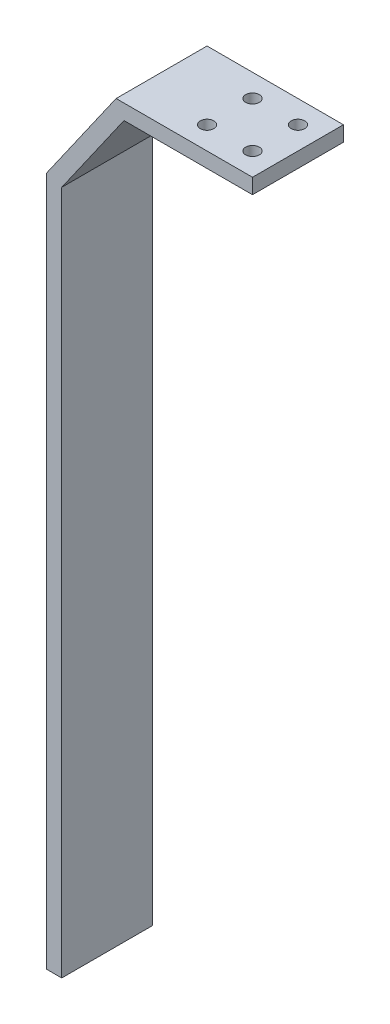
ISO-10303-21;
HEADER;
FILE_DESCRIPTION(('STEP AP214'),'2;1');
FILE_NAME('part.step','',(''),(''),'','','');
FILE_SCHEMA(('AUTOMOTIVE_DESIGN { 1 0 10303 214 1 1 1 1 }'));
ENDSEC;
DATA;
#1=APPLICATION_CONTEXT('core data for automotive mechanical design processes');
#2=APPLICATION_PROTOCOL_DEFINITION('international standard','automotive_design',2000,#1);
#3=PRODUCT_CONTEXT('',#1,'mechanical');
#4=PRODUCT('Part','Part','',(#3));
#5=PRODUCT_RELATED_PRODUCT_CATEGORY('part','',(#4));
#6=PRODUCT_DEFINITION_FORMATION('','',#4);
#7=PRODUCT_DEFINITION_CONTEXT('part definition',#1,'design');
#8=PRODUCT_DEFINITION('design','',#6,#7);
#9=PRODUCT_DEFINITION_SHAPE('','',#8);
#10=(LENGTH_UNIT() NAMED_UNIT(*) SI_UNIT(.MILLI.,.METRE.));
#11=(NAMED_UNIT(*) PLANE_ANGLE_UNIT() SI_UNIT($,.RADIAN.));
#12=(NAMED_UNIT(*) SI_UNIT($,.STERADIAN.) SOLID_ANGLE_UNIT());
#13=UNCERTAINTY_MEASURE_WITH_UNIT(LENGTH_MEASURE(1.E-05),#10,'distance_accuracy_value','');
#14=(GEOMETRIC_REPRESENTATION_CONTEXT(3) GLOBAL_UNCERTAINTY_ASSIGNED_CONTEXT((#13)) GLOBAL_UNIT_ASSIGNED_CONTEXT((#10,
#11,#12)) REPRESENTATION_CONTEXT('',''));
#15=CARTESIAN_POINT('',(0.,0.,0.));
#16=DIRECTION('',(0.,0.,1.));
#17=DIRECTION('',(1.,0.,0.));
#18=AXIS2_PLACEMENT_3D('',#15,#16,#17);
#19=CARTESIAN_POINT('',(0.,0.,60.));
#20=DIRECTION('',(1.,0.,0.));
#21=DIRECTION('',(0.,1.,0.));
#22=AXIS2_PLACEMENT_3D('',#19,#20,#21);
#23=PLANE('',#22);
#24=DIRECTION('',(0.,-1.,0.));
#25=VECTOR('',#24,1.);
#26=CARTESIAN_POINT('',(0.,0.,0.));
#27=LINE('',#26,#25);
#28=CARTESIAN_POINT('',(0.,10.,0.));
#29=VERTEX_POINT('',#28);
#30=CARTESIAN_POINT('',(0.,-445.,0.));
#31=VERTEX_POINT('',#30);
#32=EDGE_CURVE('E91',#29,#31,#27,.T.);
#33=ORIENTED_EDGE('',*,*,#32,.T.);
#34=DIRECTION('',(0.,0.,-1.));
#35=VECTOR('',#34,1.);
#36=CARTESIAN_POINT('',(0.,-445.,60.));
#37=LINE('',#36,#35);
#38=CARTESIAN_POINT('',(0.,-445.,60.));
#39=VERTEX_POINT('',#38);
#40=EDGE_CURVE('E11',#39,#31,#37,.T.);
#41=ORIENTED_EDGE('',*,*,#40,.F.);
#42=DIRECTION('',(0.,-1.,0.));
#43=VECTOR('',#42,1.);
#44=CARTESIAN_POINT('',(0.,0.,60.));
#45=LINE('',#44,#43);
#46=CARTESIAN_POINT('',(0.,10.,60.));
#47=VERTEX_POINT('',#46);
#48=EDGE_CURVE('E97',#47,#39,#45,.T.);
#49=ORIENTED_EDGE('',*,*,#48,.F.);
#50=DIRECTION('',(0.,0.,-1.));
#51=VECTOR('',#50,1.);
#52=CARTESIAN_POINT('',(0.,10.,60.));
#53=LINE('',#52,#51);
#54=EDGE_CURVE('E131',#47,#29,#53,.T.);
#55=ORIENTED_EDGE('',*,*,#54,.T.);
#56=EDGE_LOOP('',(#33,#41,#49,#55));
#57=FACE_BOUND('',#56,.T.);
#58=ADVANCED_FACE('F39',(#57),#23,.F.);
#59=CARTESIAN_POINT('',(0.,-445.,60.));
#60=DIRECTION('',(0.,1.,0.));
#61=DIRECTION('',(0.,0.,1.));
#62=AXIS2_PLACEMENT_3D('',#59,#60,#61);
#63=PLANE('',#62);
#64=DIRECTION('',(1.,0.,0.));
#65=VECTOR('',#64,1.);
#66=CARTESIAN_POINT('',(0.,-445.,0.));
#67=LINE('',#66,#65);
#68=CARTESIAN_POINT('',(10.0000000000001,-445.,0.));
#69=VERTEX_POINT('',#68);
#70=EDGE_CURVE('E136',#31,#69,#67,.T.);
#71=ORIENTED_EDGE('',*,*,#70,.T.);
#72=DIRECTION('',(0.,0.,-1.));
#73=VECTOR('',#72,1.);
#74=CARTESIAN_POINT('',(10.0000000000001,-445.,60.));
#75=LINE('',#74,#73);
#76=CARTESIAN_POINT('',(10.0000000000001,-445.,60.));
#77=VERTEX_POINT('',#76);
#78=EDGE_CURVE('E47',#77,#69,#75,.T.);
#79=ORIENTED_EDGE('',*,*,#78,.F.);
#80=DIRECTION('',(1.,0.,0.));
#81=VECTOR('',#80,1.);
#82=CARTESIAN_POINT('',(0.,-445.,60.));
#83=LINE('',#82,#81);
#84=EDGE_CURVE('E169',#39,#77,#83,.T.);
#85=ORIENTED_EDGE('',*,*,#84,.F.);
#86=ORIENTED_EDGE('',*,*,#40,.T.);
#87=EDGE_LOOP('',(#71,#79,#85,#86));
#88=FACE_BOUND('',#87,.T.);
#89=ADVANCED_FACE('F168',(#88),#63,.F.);
#90=CARTESIAN_POINT('',(10.,0.,60.));
#91=DIRECTION('',(-1.,0.,0.));
#92=DIRECTION('',(0.,0.,1.));
#93=AXIS2_PLACEMENT_3D('',#90,#91,#92);
#94=PLANE('',#93);
#95=DIRECTION('',(0.,1.,0.));
#96=VECTOR('',#95,1.);
#97=CARTESIAN_POINT('',(10.,0.,0.));
#98=LINE('',#97,#96);
#99=CARTESIAN_POINT('',(10.,6.84701211121019,0.));
#100=VERTEX_POINT('',#99);
#101=EDGE_CURVE('E140',#69,#100,#98,.T.);
#102=ORIENTED_EDGE('',*,*,#101,.T.);
#103=DIRECTION('',(0.,0.,-1.));
#104=VECTOR('',#103,1.);
#105=CARTESIAN_POINT('',(10.,6.84701211121019,60.));
#106=LINE('',#105,#104);
#107=CARTESIAN_POINT('',(10.,6.84701211121019,60.));
#108=VERTEX_POINT('',#107);
#109=EDGE_CURVE('E157',#108,#100,#106,.T.);
#110=ORIENTED_EDGE('',*,*,#109,.F.);
#111=DIRECTION('',(0.,1.,0.));
#112=VECTOR('',#111,1.);
#113=CARTESIAN_POINT('',(10.,0.,60.));
#114=LINE('',#113,#112);
#115=EDGE_CURVE('E165',#77,#108,#114,.T.);
#116=ORIENTED_EDGE('',*,*,#115,.F.);
#117=ORIENTED_EDGE('',*,*,#78,.T.);
#118=EDGE_LOOP('',(#102,#110,#116,#117));
#119=FACE_BOUND('',#118,.T.);
#120=ADVANCED_FACE('F163',(#119),#94,.F.);
#121=CARTESIAN_POINT('',(10.,6.84701211121019,60.));
#122=DIRECTION('',(-0.819152044288995,0.573576436351041,0.));
#123=DIRECTION('',(-0.573576436351041,-0.819152044288995,0.));
#124=AXIS2_PLACEMENT_3D('',#121,#122,#123);
#125=PLANE('',#124);
#126=DIRECTION('',(0.573576436351041,0.819152044288995,0.));
#127=VECTOR('',#126,1.);
#128=CARTESIAN_POINT('',(10.,6.84701211121019,0.));
#129=LINE('',#128,#127);
#130=CARTESIAN_POINT('',(51.0917854136008,65.5321635431196,0.));
#131=VERTEX_POINT('',#130);
#132=EDGE_CURVE('E142',#100,#131,#129,.T.);
#133=ORIENTED_EDGE('',*,*,#132,.T.);
#134=DIRECTION('',(0.,0.,-1.));
#135=VECTOR('',#134,1.);
#136=CARTESIAN_POINT('',(51.0917854136008,65.5321635431196,60.));
#137=LINE('',#136,#135);
#138=CARTESIAN_POINT('',(51.0917854136008,65.5321635431196,60.));
#139=VERTEX_POINT('',#138);
#140=EDGE_CURVE('E154',#139,#131,#137,.T.);
#141=ORIENTED_EDGE('',*,*,#140,.F.);
#142=DIRECTION('',(0.573576436351041,0.819152044288995,0.));
#143=VECTOR('',#142,1.);
#144=CARTESIAN_POINT('',(10.,6.84701211121019,60.));
#145=LINE('',#144,#143);
#146=EDGE_CURVE('E179',#108,#139,#145,.T.);
#147=ORIENTED_EDGE('',*,*,#146,.F.);
#148=ORIENTED_EDGE('',*,*,#109,.T.);
#149=EDGE_LOOP('',(#133,#141,#147,#148));
#150=FACE_BOUND('',#149,.T.);
#151=ADVANCED_FACE('F175',(#150),#125,.F.);
#152=CARTESIAN_POINT('',(51.0917854136008,65.5321635431196,60.));
#153=DIRECTION('',(0.,1.,0.));
#154=DIRECTION('',(-1.,0.,0.));
#155=AXIS2_PLACEMENT_3D('',#152,#153,#154);
#156=PLANE('',#155);
#157=CARTESIAN_POINT('',(120.886114908083,65.5321635431196,45.));
#158=DIRECTION('',(0.,1.,0.));
#159=DIRECTION('',(-1.,0.,0.));
#160=AXIS2_PLACEMENT_3D('',#157,#158,#159);
#161=CIRCLE('',#160,4.50000000000002);
#162=CARTESIAN_POINT('',(116.386114908083,65.5321635431196,45.));
#163=VERTEX_POINT('',#162);
#164=EDGE_CURVE('E194',#163,#163,#161,.F.);
#165=ORIENTED_EDGE('',*,*,#164,.F.);
#166=EDGE_LOOP('',(#165));
#167=FACE_BOUND('',#166,.T.);
#168=CARTESIAN_POINT('',(90.8861149080833,65.5321635431196,15.));
#169=DIRECTION('',(0.,1.,0.));
#170=DIRECTION('',(-1.,0.,0.));
#171=AXIS2_PLACEMENT_3D('',#168,#169,#170);
#172=CIRCLE('',#171,4.5);
#173=CARTESIAN_POINT('',(86.3861149080833,65.5321635431196,15.));
#174=VERTEX_POINT('',#173);
#175=EDGE_CURVE('E195',#174,#174,#172,.F.);
#176=ORIENTED_EDGE('',*,*,#175,.F.);
#177=EDGE_LOOP('',(#176));
#178=FACE_BOUND('',#177,.T.);
#179=CARTESIAN_POINT('',(90.8861149080833,65.5321635431196,45.));
#180=DIRECTION('',(0.,1.,0.));
#181=DIRECTION('',(-1.,0.,0.));
#182=AXIS2_PLACEMENT_3D('',#179,#180,#181);
#183=CIRCLE('',#182,4.50000000000001);
#184=CARTESIAN_POINT('',(86.3861149080833,65.5321635431196,45.));
#185=VERTEX_POINT('',#184);
#186=EDGE_CURVE('E205',#185,#185,#183,.F.);
#187=ORIENTED_EDGE('',*,*,#186,.F.);
#188=EDGE_LOOP('',(#187));
#189=FACE_BOUND('',#188,.T.);
#190=CARTESIAN_POINT('',(120.886114908083,65.5321635431196,15.));
#191=DIRECTION('',(0.,1.,0.));
#192=DIRECTION('',(-1.,0.,0.));
#193=AXIS2_PLACEMENT_3D('',#190,#191,#192);
#194=CIRCLE('',#193,4.49999999999999);
#195=CARTESIAN_POINT('',(116.386114908083,65.5321635431196,15.));
#196=VERTEX_POINT('',#195);
#197=EDGE_CURVE('E137',#196,#196,#194,.F.);
#198=ORIENTED_EDGE('',*,*,#197,.F.);
#199=EDGE_LOOP('',(#198));
#200=FACE_BOUND('',#199,.T.);
#201=DIRECTION('',(1.,0.,0.));
#202=VECTOR('',#201,1.);
#203=CARTESIAN_POINT('',(51.0917854136008,65.5321635431196,0.));
#204=LINE('',#203,#202);
#205=CARTESIAN_POINT('',(135.886114908083,65.5321635431196,0.));
#206=VERTEX_POINT('',#205);
#207=EDGE_CURVE('E144',#131,#206,#204,.T.);
#208=ORIENTED_EDGE('',*,*,#207,.T.);
#209=DIRECTION('',(0.,0.,-1.));
#210=VECTOR('',#209,1.);
#211=CARTESIAN_POINT('',(135.886114908083,65.5321635431196,60.));
#212=LINE('',#211,#210);
#213=CARTESIAN_POINT('',(135.886114908083,65.5321635431196,60.));
#214=VERTEX_POINT('',#213);
#215=EDGE_CURVE('E126',#214,#206,#212,.T.);
#216=ORIENTED_EDGE('',*,*,#215,.F.);
#217=DIRECTION('',(1.,0.,0.));
#218=VECTOR('',#217,1.);
#219=CARTESIAN_POINT('',(51.0917854136008,65.5321635431196,60.));
#220=LINE('',#219,#218);
#221=EDGE_CURVE('E117',#139,#214,#220,.T.);
#222=ORIENTED_EDGE('',*,*,#221,.F.);
#223=ORIENTED_EDGE('',*,*,#140,.T.);
#224=EDGE_LOOP('',(#208,#216,#222,#223));
#225=FACE_BOUND('',#224,.T.);
#226=ADVANCED_FACE('F178',(#167,#178,#189,#200,#225),#156,.F.);
#227=CARTESIAN_POINT('',(135.886114908083,75.5321635431196,60.));
#228=DIRECTION('',(-1.,0.,0.));
#229=DIRECTION('',(0.,0.,1.));
#230=AXIS2_PLACEMENT_3D('',#227,#228,#229);
#231=PLANE('',#230);
#232=DIRECTION('',(0.,1.,0.));
#233=VECTOR('',#232,1.);
#234=CARTESIAN_POINT('',(135.886114908083,75.5321635431196,0.));
#235=LINE('',#234,#233);
#236=CARTESIAN_POINT('',(135.886114908083,75.5321635431196,0.));
#237=VERTEX_POINT('',#236);
#238=EDGE_CURVE('E125',#206,#237,#235,.T.);
#239=ORIENTED_EDGE('',*,*,#238,.T.);
#240=DIRECTION('',(0.,0.,-1.));
#241=VECTOR('',#240,1.);
#242=CARTESIAN_POINT('',(135.886114908083,75.5321635431196,60.));
#243=LINE('',#242,#241);
#244=CARTESIAN_POINT('',(135.886114908083,75.5321635431196,60.));
#245=VERTEX_POINT('',#244);
#246=EDGE_CURVE('E122',#245,#237,#243,.T.);
#247=ORIENTED_EDGE('',*,*,#246,.F.);
#248=DIRECTION('',(0.,1.,0.));
#249=VECTOR('',#248,1.);
#250=CARTESIAN_POINT('',(135.886114908083,75.5321635431196,60.));
#251=LINE('',#250,#249);
#252=EDGE_CURVE('E111',#214,#245,#251,.T.);
#253=ORIENTED_EDGE('',*,*,#252,.F.);
#254=ORIENTED_EDGE('',*,*,#215,.T.);
#255=EDGE_LOOP('',(#239,#247,#253,#254));
#256=FACE_BOUND('',#255,.T.);
#257=ADVANCED_FACE('F123',(#256),#231,.F.);
#258=CARTESIAN_POINT('',(45.8861149080833,75.5321635431196,60.));
#259=DIRECTION('',(0.,-1.,0.));
#260=DIRECTION('',(1.,0.,0.));
#261=AXIS2_PLACEMENT_3D('',#258,#259,#260);
#262=PLANE('',#261);
#263=CARTESIAN_POINT('',(120.886114908083,75.5321635431196,45.));
#264=DIRECTION('',(0.,1.,0.));
#265=DIRECTION('',(-1.,0.,0.));
#266=AXIS2_PLACEMENT_3D('',#263,#264,#265);
#267=CIRCLE('',#266,4.50000000000002);
#268=CARTESIAN_POINT('',(116.386114908083,75.5321635431196,45.));
#269=VERTEX_POINT('',#268);
#270=EDGE_CURVE('E190',#269,#269,#267,.T.);
#271=ORIENTED_EDGE('',*,*,#270,.F.);
#272=EDGE_LOOP('',(#271));
#273=FACE_BOUND('',#272,.T.);
#274=CARTESIAN_POINT('',(90.8861149080833,75.5321635431196,15.));
#275=DIRECTION('',(0.,1.,0.));
#276=DIRECTION('',(-1.,0.,0.));
#277=AXIS2_PLACEMENT_3D('',#274,#275,#276);
#278=CIRCLE('',#277,4.5);
#279=CARTESIAN_POINT('',(86.3861149080833,75.5321635431196,15.));
#280=VERTEX_POINT('',#279);
#281=EDGE_CURVE('E191',#280,#280,#278,.T.);
#282=ORIENTED_EDGE('',*,*,#281,.F.);
#283=EDGE_LOOP('',(#282));
#284=FACE_BOUND('',#283,.T.);
#285=CARTESIAN_POINT('',(90.8861149080833,75.5321635431196,45.));
#286=DIRECTION('',(0.,1.,0.));
#287=DIRECTION('',(-1.,0.,0.));
#288=AXIS2_PLACEMENT_3D('',#285,#286,#287);
#289=CIRCLE('',#288,4.50000000000001);
#290=CARTESIAN_POINT('',(86.3861149080833,75.5321635431196,45.));
#291=VERTEX_POINT('',#290);
#292=EDGE_CURVE('E198',#291,#291,#289,.T.);
#293=ORIENTED_EDGE('',*,*,#292,.F.);
#294=EDGE_LOOP('',(#293));
#295=FACE_BOUND('',#294,.T.);
#296=CARTESIAN_POINT('',(120.886114908083,75.5321635431196,15.));
#297=DIRECTION('',(0.,1.,0.));
#298=DIRECTION('',(-1.,0.,0.));
#299=AXIS2_PLACEMENT_3D('',#296,#297,#298);
#300=CIRCLE('',#299,4.49999999999999);
#301=CARTESIAN_POINT('',(116.386114908083,75.5321635431196,15.));
#302=VERTEX_POINT('',#301);
#303=EDGE_CURVE('E187',#302,#302,#300,.T.);
#304=ORIENTED_EDGE('',*,*,#303,.F.);
#305=EDGE_LOOP('',(#304));
#306=FACE_BOUND('',#305,.T.);
#307=DIRECTION('',(-1.,0.,0.));
#308=VECTOR('',#307,1.);
#309=CARTESIAN_POINT('',(45.8861149080833,75.5321635431196,0.));
#310=LINE('',#309,#308);
#311=CARTESIAN_POINT('',(45.8861149080833,75.5321635431196,0.));
#312=VERTEX_POINT('',#311);
#313=EDGE_CURVE('E84',#237,#312,#310,.T.);
#314=ORIENTED_EDGE('',*,*,#313,.T.);
#315=DIRECTION('',(0.,0.,-1.));
#316=VECTOR('',#315,1.);
#317=CARTESIAN_POINT('',(45.8861149080833,75.5321635431196,60.));
#318=LINE('',#317,#316);
#319=CARTESIAN_POINT('',(45.8861149080833,75.5321635431196,60.));
#320=VERTEX_POINT('',#319);
#321=EDGE_CURVE('E127',#320,#312,#318,.T.);
#322=ORIENTED_EDGE('',*,*,#321,.F.);
#323=DIRECTION('',(-1.,0.,0.));
#324=VECTOR('',#323,1.);
#325=CARTESIAN_POINT('',(45.8861149080833,75.5321635431196,60.));
#326=LINE('',#325,#324);
#327=EDGE_CURVE('E115',#245,#320,#326,.T.);
#328=ORIENTED_EDGE('',*,*,#327,.F.);
#329=ORIENTED_EDGE('',*,*,#246,.T.);
#330=EDGE_LOOP('',(#314,#322,#328,#329));
#331=FACE_BOUND('',#330,.T.);
#332=ADVANCED_FACE('F129',(#273,#284,#295,#306,#331),#262,.F.);
#333=CARTESIAN_POINT('',(0.,10.,60.));
#334=DIRECTION('',(0.819152044288995,-0.573576436351041,0.));
#335=DIRECTION('',(0.573576436351041,0.819152044288995,0.));
#336=AXIS2_PLACEMENT_3D('',#333,#334,#335);
#337=PLANE('',#336);
#338=DIRECTION('',(-0.573576436351041,-0.819152044288995,0.));
#339=VECTOR('',#338,1.);
#340=CARTESIAN_POINT('',(0.,10.,0.));
#341=LINE('',#340,#339);
#342=EDGE_CURVE('E148',#312,#29,#341,.T.);
#343=ORIENTED_EDGE('',*,*,#342,.T.);
#344=ORIENTED_EDGE('',*,*,#54,.F.);
#345=DIRECTION('',(-0.573576436351041,-0.819152044288995,0.));
#346=VECTOR('',#345,1.);
#347=CARTESIAN_POINT('',(0.,10.,60.));
#348=LINE('',#347,#346);
#349=EDGE_CURVE('E55',#320,#47,#348,.T.);
#350=ORIENTED_EDGE('',*,*,#349,.F.);
#351=ORIENTED_EDGE('',*,*,#321,.T.);
#352=EDGE_LOOP('',(#343,#344,#350,#351));
#353=FACE_BOUND('',#352,.T.);
#354=ADVANCED_FACE('F238',(#353),#337,.F.);
#355=CARTESIAN_POINT('',(0.,0.,60.));
#356=DIRECTION('',(0.,0.,-1.));
#357=DIRECTION('',(-1.,0.,0.));
#358=AXIS2_PLACEMENT_3D('',#355,#356,#357);
#359=PLANE('',#358);
#360=ORIENTED_EDGE('',*,*,#48,.T.);
#361=ORIENTED_EDGE('',*,*,#84,.T.);
#362=ORIENTED_EDGE('',*,*,#115,.T.);
#363=ORIENTED_EDGE('',*,*,#146,.T.);
#364=ORIENTED_EDGE('',*,*,#221,.T.);
#365=ORIENTED_EDGE('',*,*,#252,.T.);
#366=ORIENTED_EDGE('',*,*,#327,.T.);
#367=ORIENTED_EDGE('',*,*,#349,.T.);
#368=EDGE_LOOP('',(#360,#361,#362,#363,#364,#365,#366,#367));
#369=FACE_BOUND('',#368,.T.);
#370=ADVANCED_FACE('F113',(#369),#359,.F.);
#371=CARTESIAN_POINT('',(0.,0.,0.));
#372=DIRECTION('',(0.,0.,-1.));
#373=DIRECTION('',(-1.,0.,0.));
#374=AXIS2_PLACEMENT_3D('',#371,#372,#373);
#375=PLANE('',#374);
#376=ORIENTED_EDGE('',*,*,#32,.F.);
#377=ORIENTED_EDGE('',*,*,#342,.F.);
#378=ORIENTED_EDGE('',*,*,#313,.F.);
#379=ORIENTED_EDGE('',*,*,#238,.F.);
#380=ORIENTED_EDGE('',*,*,#207,.F.);
#381=ORIENTED_EDGE('',*,*,#132,.F.);
#382=ORIENTED_EDGE('',*,*,#101,.F.);
#383=ORIENTED_EDGE('',*,*,#70,.F.);
#384=EDGE_LOOP('',(#376,#377,#378,#379,#380,#381,#382,#383));
#385=FACE_BOUND('',#384,.T.);
#386=ADVANCED_FACE('F170',(#385),#375,.T.);
#387=CARTESIAN_POINT('',(120.886114908083,-445.001,15.));
#388=DIRECTION('',(0.,1.,0.));
#389=DIRECTION('',(-1.,0.,0.));
#390=AXIS2_PLACEMENT_3D('',#387,#388,#389);
#391=CYLINDRICAL_SURFACE('',#390,4.49999999999999);
#392=ORIENTED_EDGE('',*,*,#303,.T.);
#393=EDGE_LOOP('',(#392));
#394=FACE_BOUND('',#393,.T.);
#395=ORIENTED_EDGE('',*,*,#197,.T.);
#396=EDGE_LOOP('',(#395));
#397=FACE_BOUND('',#396,.T.);
#398=ADVANCED_FACE('F217',(#394,#397),#391,.F.);
#399=CARTESIAN_POINT('',(90.8861149080834,-445.001,45.));
#400=DIRECTION('',(0.,1.,0.));
#401=DIRECTION('',(-1.,0.,0.));
#402=AXIS2_PLACEMENT_3D('',#399,#400,#401);
#403=CYLINDRICAL_SURFACE('',#402,4.50000000000001);
#404=ORIENTED_EDGE('',*,*,#292,.T.);
#405=EDGE_LOOP('',(#404));
#406=FACE_BOUND('',#405,.T.);
#407=ORIENTED_EDGE('',*,*,#186,.T.);
#408=EDGE_LOOP('',(#407));
#409=FACE_BOUND('',#408,.T.);
#410=ADVANCED_FACE('F209',(#406,#409),#403,.F.);
#411=CARTESIAN_POINT('',(90.8861149080834,-445.001,15.));
#412=DIRECTION('',(0.,1.,0.));
#413=DIRECTION('',(-1.,0.,0.));
#414=AXIS2_PLACEMENT_3D('',#411,#412,#413);
#415=CYLINDRICAL_SURFACE('',#414,4.5);
#416=ORIENTED_EDGE('',*,*,#281,.T.);
#417=EDGE_LOOP('',(#416));
#418=FACE_BOUND('',#417,.T.);
#419=ORIENTED_EDGE('',*,*,#175,.T.);
#420=EDGE_LOOP('',(#419));
#421=FACE_BOUND('',#420,.T.);
#422=ADVANCED_FACE('F225',(#418,#421),#415,.F.);
#423=CARTESIAN_POINT('',(120.886114908083,-445.001,45.));
#424=DIRECTION('',(0.,1.,0.));
#425=DIRECTION('',(-1.,0.,0.));
#426=AXIS2_PLACEMENT_3D('',#423,#424,#425);
#427=CYLINDRICAL_SURFACE('',#426,4.50000000000002);
#428=ORIENTED_EDGE('',*,*,#270,.T.);
#429=EDGE_LOOP('',(#428));
#430=FACE_BOUND('',#429,.T.);
#431=ORIENTED_EDGE('',*,*,#164,.T.);
#432=EDGE_LOOP('',(#431));
#433=FACE_BOUND('',#432,.T.);
#434=ADVANCED_FACE('F312',(#430,#433),#427,.F.);
#435=CLOSED_SHELL('',(#58,#89,#120,#151,#226,#257,#332,#354,#370,#386,#398,#410,#422,#434));
#436=MANIFOLD_SOLID_BREP('B2',#435);
#437=ADVANCED_BREP_SHAPE_REPRESENTATION('',(#18,#436),#14);
#438=SHAPE_DEFINITION_REPRESENTATION(#9,#437);
ENDSEC;
END-ISO-10303-21;
